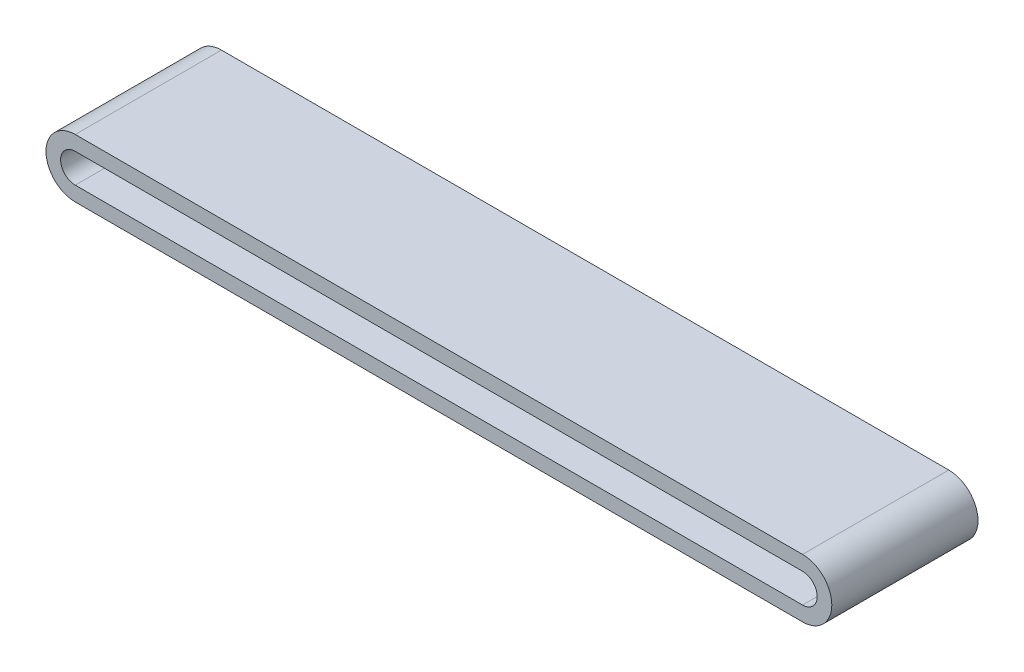
ISO-10303-21;
HEADER;
FILE_DESCRIPTION(('STEP AP214'),'2;1');
FILE_NAME('part.step','',(''),(''),'','','');
FILE_SCHEMA(('AUTOMOTIVE_DESIGN { 1 0 10303 214 1 1 1 1 }'));
ENDSEC;
DATA;
#1=APPLICATION_CONTEXT('core data for automotive mechanical design processes');
#2=APPLICATION_PROTOCOL_DEFINITION('international standard','automotive_design',2000,#1);
#3=PRODUCT_CONTEXT('',#1,'mechanical');
#4=PRODUCT('Part','Part','',(#3));
#5=PRODUCT_RELATED_PRODUCT_CATEGORY('part','',(#4));
#6=PRODUCT_DEFINITION_FORMATION('','',#4);
#7=PRODUCT_DEFINITION_CONTEXT('part definition',#1,'design');
#8=PRODUCT_DEFINITION('design','',#6,#7);
#9=PRODUCT_DEFINITION_SHAPE('','',#8);
#10=(LENGTH_UNIT() NAMED_UNIT(*) SI_UNIT(.MILLI.,.METRE.));
#11=(NAMED_UNIT(*) PLANE_ANGLE_UNIT() SI_UNIT($,.RADIAN.));
#12=(NAMED_UNIT(*) SI_UNIT($,.STERADIAN.) SOLID_ANGLE_UNIT());
#13=UNCERTAINTY_MEASURE_WITH_UNIT(LENGTH_MEASURE(1.E-05),#10,'distance_accuracy_value','');
#14=(GEOMETRIC_REPRESENTATION_CONTEXT(3) GLOBAL_UNCERTAINTY_ASSIGNED_CONTEXT((#13)) GLOBAL_UNIT_ASSIGNED_CONTEXT((#10,
#11,#12)) REPRESENTATION_CONTEXT('',''));
#15=CARTESIAN_POINT('',(0.,0.,0.));
#16=DIRECTION('',(0.,0.,1.));
#17=DIRECTION('',(1.,0.,0.));
#18=AXIS2_PLACEMENT_3D('',#15,#16,#17);
#19=CARTESIAN_POINT('',(-49.75,0.,20.));
#20=DIRECTION('',(0.,0.,1.));
#21=DIRECTION('',(1.,0.,0.));
#22=AXIS2_PLACEMENT_3D('',#19,#20,#21);
#23=PLANE('',#22);
#24=CARTESIAN_POINT('',(-49.75,0.,20.));
#25=DIRECTION('',(0.,0.,1.));
#26=DIRECTION('',(1.,0.,0.));
#27=AXIS2_PLACEMENT_3D('',#24,#25,#26);
#28=CIRCLE('',#27,4.);
#29=CARTESIAN_POINT('',(-49.75,4.,20.));
#30=VERTEX_POINT('',#29);
#31=CARTESIAN_POINT('',(-49.75,-4.,20.));
#32=VERTEX_POINT('',#31);
#33=EDGE_CURVE('E137',#30,#32,#28,.T.);
#34=ORIENTED_EDGE('',*,*,#33,.T.);
#35=DIRECTION('',(1.,0.,0.));
#36=VECTOR('',#35,1.);
#37=CARTESIAN_POINT('',(-49.75,-4.,20.));
#38=LINE('',#37,#36);
#39=CARTESIAN_POINT('',(49.75,-4.,20.));
#40=VERTEX_POINT('',#39);
#41=EDGE_CURVE('E140',#32,#40,#38,.T.);
#42=ORIENTED_EDGE('',*,*,#41,.T.);
#43=CARTESIAN_POINT('',(49.75,0.,20.));
#44=DIRECTION('',(0.,0.,1.));
#45=DIRECTION('',(1.,0.,0.));
#46=AXIS2_PLACEMENT_3D('',#43,#44,#45);
#47=CIRCLE('',#46,4.);
#48=CARTESIAN_POINT('',(49.75,4.,20.));
#49=VERTEX_POINT('',#48);
#50=EDGE_CURVE('E143',#40,#49,#47,.T.);
#51=ORIENTED_EDGE('',*,*,#50,.T.);
#52=DIRECTION('',(-1.,0.,0.));
#53=VECTOR('',#52,1.);
#54=CARTESIAN_POINT('',(-49.75,4.,20.));
#55=LINE('',#54,#53);
#56=EDGE_CURVE('E145',#49,#30,#55,.T.);
#57=ORIENTED_EDGE('',*,*,#56,.T.);
#58=EDGE_LOOP('',(#34,#42,#51,#57));
#59=FACE_BOUND('',#58,.T.);
#60=DIRECTION('',(1.,0.,0.));
#61=VECTOR('',#60,1.);
#62=CARTESIAN_POINT('',(-49.75,-2.00000000000001,20.));
#63=LINE('',#62,#61);
#64=CARTESIAN_POINT('',(-49.75,-2.00000000000001,20.));
#65=VERTEX_POINT('',#64);
#66=CARTESIAN_POINT('',(49.75,-2.00000000000001,20.));
#67=VERTEX_POINT('',#66);
#68=EDGE_CURVE('E109',#65,#67,#63,.T.);
#69=ORIENTED_EDGE('',*,*,#68,.F.);
#70=CARTESIAN_POINT('',(-49.75,0.,20.));
#71=DIRECTION('',(0.,0.,1.));
#72=DIRECTION('',(1.,0.,0.));
#73=AXIS2_PLACEMENT_3D('',#70,#71,#72);
#74=CIRCLE('',#73,2.00000000000001);
#75=CARTESIAN_POINT('',(-49.75,2.00000000000001,20.));
#76=VERTEX_POINT('',#75);
#77=EDGE_CURVE('E101',#76,#65,#74,.T.);
#78=ORIENTED_EDGE('',*,*,#77,.F.);
#79=DIRECTION('',(-1.,0.,0.));
#80=VECTOR('',#79,1.);
#81=CARTESIAN_POINT('',(-49.75,2.00000000000001,20.));
#82=LINE('',#81,#80);
#83=CARTESIAN_POINT('',(49.75,2.00000000000001,20.));
#84=VERTEX_POINT('',#83);
#85=EDGE_CURVE('E123',#84,#76,#82,.T.);
#86=ORIENTED_EDGE('',*,*,#85,.F.);
#87=CARTESIAN_POINT('',(49.75,0.,20.));
#88=DIRECTION('',(0.,0.,1.));
#89=DIRECTION('',(1.,0.,0.));
#90=AXIS2_PLACEMENT_3D('',#87,#88,#89);
#91=CIRCLE('',#90,2.00000000000001);
#92=EDGE_CURVE('E121',#67,#84,#91,.T.);
#93=ORIENTED_EDGE('',*,*,#92,.F.);
#94=EDGE_LOOP('',(#69,#78,#86,#93));
#95=FACE_BOUND('',#94,.T.);
#96=ADVANCED_FACE('F36',(#59,#95),#23,.T.);
#97=CARTESIAN_POINT('',(-49.75,0.,0.));
#98=DIRECTION('',(0.,0.,1.));
#99=DIRECTION('',(1.,0.,0.));
#100=AXIS2_PLACEMENT_3D('',#97,#98,#99);
#101=PLANE('',#100);
#102=CARTESIAN_POINT('',(-49.75,0.,0.));
#103=DIRECTION('',(0.,0.,1.));
#104=DIRECTION('',(1.,0.,0.));
#105=AXIS2_PLACEMENT_3D('',#102,#103,#104);
#106=CIRCLE('',#105,4.);
#107=CARTESIAN_POINT('',(-49.75,4.,0.));
#108=VERTEX_POINT('',#107);
#109=CARTESIAN_POINT('',(-49.75,-4.,0.));
#110=VERTEX_POINT('',#109);
#111=EDGE_CURVE('E117',#108,#110,#106,.T.);
#112=ORIENTED_EDGE('',*,*,#111,.F.);
#113=DIRECTION('',(-1.,0.,0.));
#114=VECTOR('',#113,1.);
#115=CARTESIAN_POINT('',(-49.75,4.,0.));
#116=LINE('',#115,#114);
#117=CARTESIAN_POINT('',(49.75,4.,0.));
#118=VERTEX_POINT('',#117);
#119=EDGE_CURVE('E141',#118,#108,#116,.T.);
#120=ORIENTED_EDGE('',*,*,#119,.F.);
#121=CARTESIAN_POINT('',(49.75,0.,0.));
#122=DIRECTION('',(0.,0.,1.));
#123=DIRECTION('',(1.,0.,0.));
#124=AXIS2_PLACEMENT_3D('',#121,#122,#123);
#125=CIRCLE('',#124,4.);
#126=CARTESIAN_POINT('',(49.75,-4.,0.));
#127=VERTEX_POINT('',#126);
#128=EDGE_CURVE('E152',#127,#118,#125,.T.);
#129=ORIENTED_EDGE('',*,*,#128,.F.);
#130=DIRECTION('',(1.,0.,0.));
#131=VECTOR('',#130,1.);
#132=CARTESIAN_POINT('',(-49.75,-4.,0.));
#133=LINE('',#132,#131);
#134=EDGE_CURVE('E150',#110,#127,#133,.T.);
#135=ORIENTED_EDGE('',*,*,#134,.F.);
#136=EDGE_LOOP('',(#112,#120,#129,#135));
#137=FACE_BOUND('',#136,.T.);
#138=CARTESIAN_POINT('',(-49.75,0.,0.));
#139=DIRECTION('',(0.,0.,1.));
#140=DIRECTION('',(1.,0.,0.));
#141=AXIS2_PLACEMENT_3D('',#138,#139,#140);
#142=CIRCLE('',#141,2.00000000000001);
#143=CARTESIAN_POINT('',(-49.75,2.00000000000001,0.));
#144=VERTEX_POINT('',#143);
#145=CARTESIAN_POINT('',(-49.75,-2.00000000000001,0.));
#146=VERTEX_POINT('',#145);
#147=EDGE_CURVE('E59',#144,#146,#142,.T.);
#148=ORIENTED_EDGE('',*,*,#147,.T.);
#149=DIRECTION('',(1.,0.,0.));
#150=VECTOR('',#149,1.);
#151=CARTESIAN_POINT('',(-49.75,-2.00000000000001,0.));
#152=LINE('',#151,#150);
#153=CARTESIAN_POINT('',(49.75,-2.00000000000001,0.));
#154=VERTEX_POINT('',#153);
#155=EDGE_CURVE('E116',#146,#154,#152,.T.);
#156=ORIENTED_EDGE('',*,*,#155,.T.);
#157=CARTESIAN_POINT('',(49.75,0.,0.));
#158=DIRECTION('',(0.,0.,1.));
#159=DIRECTION('',(1.,0.,0.));
#160=AXIS2_PLACEMENT_3D('',#157,#158,#159);
#161=CIRCLE('',#160,2.00000000000001);
#162=CARTESIAN_POINT('',(49.75,2.00000000000001,0.));
#163=VERTEX_POINT('',#162);
#164=EDGE_CURVE('E129',#154,#163,#161,.T.);
#165=ORIENTED_EDGE('',*,*,#164,.T.);
#166=DIRECTION('',(-1.,0.,0.));
#167=VECTOR('',#166,1.);
#168=CARTESIAN_POINT('',(-49.75,2.00000000000001,0.));
#169=LINE('',#168,#167);
#170=EDGE_CURVE('E110',#163,#144,#169,.T.);
#171=ORIENTED_EDGE('',*,*,#170,.T.);
#172=EDGE_LOOP('',(#148,#156,#165,#171));
#173=FACE_BOUND('',#172,.T.);
#174=ADVANCED_FACE('F170',(#137,#173),#101,.F.);
#175=CARTESIAN_POINT('',(-49.75,0.,20.));
#176=DIRECTION('',(0.,0.,-1.));
#177=DIRECTION('',(-1.,0.,0.));
#178=AXIS2_PLACEMENT_3D('',#175,#176,#177);
#179=CYLINDRICAL_SURFACE('',#178,4.);
#180=ORIENTED_EDGE('',*,*,#111,.T.);
#181=DIRECTION('',(0.,0.,-1.));
#182=VECTOR('',#181,1.);
#183=CARTESIAN_POINT('',(-49.75,-4.,20.));
#184=LINE('',#183,#182);
#185=EDGE_CURVE('E11',#32,#110,#184,.T.);
#186=ORIENTED_EDGE('',*,*,#185,.F.);
#187=ORIENTED_EDGE('',*,*,#33,.F.);
#188=DIRECTION('',(0.,0.,-1.));
#189=VECTOR('',#188,1.);
#190=CARTESIAN_POINT('',(-49.75,4.,20.));
#191=LINE('',#190,#189);
#192=EDGE_CURVE('E147',#30,#108,#191,.T.);
#193=ORIENTED_EDGE('',*,*,#192,.T.);
#194=EDGE_LOOP('',(#180,#186,#187,#193));
#195=FACE_BOUND('',#194,.T.);
#196=ADVANCED_FACE('F38',(#195),#179,.T.);
#197=CARTESIAN_POINT('',(-49.75,-4.,20.));
#198=DIRECTION('',(0.,1.,0.));
#199=DIRECTION('',(0.,0.,1.));
#200=AXIS2_PLACEMENT_3D('',#197,#198,#199);
#201=PLANE('',#200);
#202=ORIENTED_EDGE('',*,*,#134,.T.);
#203=DIRECTION('',(0.,0.,-1.));
#204=VECTOR('',#203,1.);
#205=CARTESIAN_POINT('',(49.75,-4.,20.));
#206=LINE('',#205,#204);
#207=EDGE_CURVE('E44',#40,#127,#206,.T.);
#208=ORIENTED_EDGE('',*,*,#207,.F.);
#209=ORIENTED_EDGE('',*,*,#41,.F.);
#210=ORIENTED_EDGE('',*,*,#185,.T.);
#211=EDGE_LOOP('',(#202,#208,#209,#210));
#212=FACE_BOUND('',#211,.T.);
#213=ADVANCED_FACE('F180',(#212),#201,.F.);
#214=CARTESIAN_POINT('',(49.75,0.,20.));
#215=DIRECTION('',(0.,0.,-1.));
#216=DIRECTION('',(-1.,0.,0.));
#217=AXIS2_PLACEMENT_3D('',#214,#215,#216);
#218=CYLINDRICAL_SURFACE('',#217,4.);
#219=ORIENTED_EDGE('',*,*,#128,.T.);
#220=DIRECTION('',(0.,0.,-1.));
#221=VECTOR('',#220,1.);
#222=CARTESIAN_POINT('',(49.75,4.,20.));
#223=LINE('',#222,#221);
#224=EDGE_CURVE('E157',#49,#118,#223,.T.);
#225=ORIENTED_EDGE('',*,*,#224,.F.);
#226=ORIENTED_EDGE('',*,*,#50,.F.);
#227=ORIENTED_EDGE('',*,*,#207,.T.);
#228=EDGE_LOOP('',(#219,#225,#226,#227));
#229=FACE_BOUND('',#228,.T.);
#230=ADVANCED_FACE('F164',(#229),#218,.T.);
#231=CARTESIAN_POINT('',(-49.75,4.,20.));
#232=DIRECTION('',(0.,-1.,0.));
#233=DIRECTION('',(0.,0.,-1.));
#234=AXIS2_PLACEMENT_3D('',#231,#232,#233);
#235=PLANE('',#234);
#236=ORIENTED_EDGE('',*,*,#119,.T.);
#237=ORIENTED_EDGE('',*,*,#192,.F.);
#238=ORIENTED_EDGE('',*,*,#56,.F.);
#239=ORIENTED_EDGE('',*,*,#224,.T.);
#240=EDGE_LOOP('',(#236,#237,#238,#239));
#241=FACE_BOUND('',#240,.T.);
#242=ADVANCED_FACE('F174',(#241),#235,.F.);
#243=CARTESIAN_POINT('',(-49.75,0.,20.));
#244=DIRECTION('',(0.,0.,-1.));
#245=DIRECTION('',(-1.,0.,0.));
#246=AXIS2_PLACEMENT_3D('',#243,#244,#245);
#247=CYLINDRICAL_SURFACE('',#246,2.00000000000001);
#248=ORIENTED_EDGE('',*,*,#147,.F.);
#249=DIRECTION('',(0.,0.,-1.));
#250=VECTOR('',#249,1.);
#251=CARTESIAN_POINT('',(-49.75,2.00000000000001,20.));
#252=LINE('',#251,#250);
#253=EDGE_CURVE('E105',#76,#144,#252,.T.);
#254=ORIENTED_EDGE('',*,*,#253,.F.);
#255=ORIENTED_EDGE('',*,*,#77,.T.);
#256=DIRECTION('',(0.,0.,-1.));
#257=VECTOR('',#256,1.);
#258=CARTESIAN_POINT('',(-49.75,-2.00000000000001,20.));
#259=LINE('',#258,#257);
#260=EDGE_CURVE('E104',#65,#146,#259,.T.);
#261=ORIENTED_EDGE('',*,*,#260,.T.);
#262=EDGE_LOOP('',(#248,#254,#255,#261));
#263=FACE_BOUND('',#262,.T.);
#264=ADVANCED_FACE('F103',(#263),#247,.F.);
#265=CARTESIAN_POINT('',(-49.75,-2.00000000000001,20.));
#266=DIRECTION('',(0.,1.,0.));
#267=DIRECTION('',(0.,0.,1.));
#268=AXIS2_PLACEMENT_3D('',#265,#266,#267);
#269=PLANE('',#268);
#270=ORIENTED_EDGE('',*,*,#155,.F.);
#271=ORIENTED_EDGE('',*,*,#260,.F.);
#272=ORIENTED_EDGE('',*,*,#68,.T.);
#273=DIRECTION('',(0.,0.,-1.));
#274=VECTOR('',#273,1.);
#275=CARTESIAN_POINT('',(49.75,-2.00000000000001,20.));
#276=LINE('',#275,#274);
#277=EDGE_CURVE('E118',#67,#154,#276,.T.);
#278=ORIENTED_EDGE('',*,*,#277,.T.);
#279=EDGE_LOOP('',(#270,#271,#272,#278));
#280=FACE_BOUND('',#279,.T.);
#281=ADVANCED_FACE('F113',(#280),#269,.T.);
#282=CARTESIAN_POINT('',(49.75,0.,20.));
#283=DIRECTION('',(0.,0.,-1.));
#284=DIRECTION('',(-1.,0.,0.));
#285=AXIS2_PLACEMENT_3D('',#282,#283,#284);
#286=CYLINDRICAL_SURFACE('',#285,2.00000000000001);
#287=ORIENTED_EDGE('',*,*,#164,.F.);
#288=ORIENTED_EDGE('',*,*,#277,.F.);
#289=ORIENTED_EDGE('',*,*,#92,.T.);
#290=DIRECTION('',(0.,0.,-1.));
#291=VECTOR('',#290,1.);
#292=CARTESIAN_POINT('',(49.75,2.00000000000001,20.));
#293=LINE('',#292,#291);
#294=EDGE_CURVE('E51',#84,#163,#293,.T.);
#295=ORIENTED_EDGE('',*,*,#294,.T.);
#296=EDGE_LOOP('',(#287,#288,#289,#295));
#297=FACE_BOUND('',#296,.T.);
#298=ADVANCED_FACE('F203',(#297),#286,.F.);
#299=CARTESIAN_POINT('',(-49.75,2.00000000000001,20.));
#300=DIRECTION('',(0.,-1.,0.));
#301=DIRECTION('',(0.,0.,-1.));
#302=AXIS2_PLACEMENT_3D('',#299,#300,#301);
#303=PLANE('',#302);
#304=ORIENTED_EDGE('',*,*,#170,.F.);
#305=ORIENTED_EDGE('',*,*,#294,.F.);
#306=ORIENTED_EDGE('',*,*,#85,.T.);
#307=ORIENTED_EDGE('',*,*,#253,.T.);
#308=EDGE_LOOP('',(#304,#305,#306,#307));
#309=FACE_BOUND('',#308,.T.);
#310=ADVANCED_FACE('F207',(#309),#303,.T.);
#311=CLOSED_SHELL('',(#96,#174,#196,#213,#230,#242,#264,#281,#298,#310));
#312=MANIFOLD_SOLID_BREP('B2',#311);
#313=ADVANCED_BREP_SHAPE_REPRESENTATION('',(#18,#312),#14);
#314=SHAPE_DEFINITION_REPRESENTATION(#9,#313);
ENDSEC;
END-ISO-10303-21;
